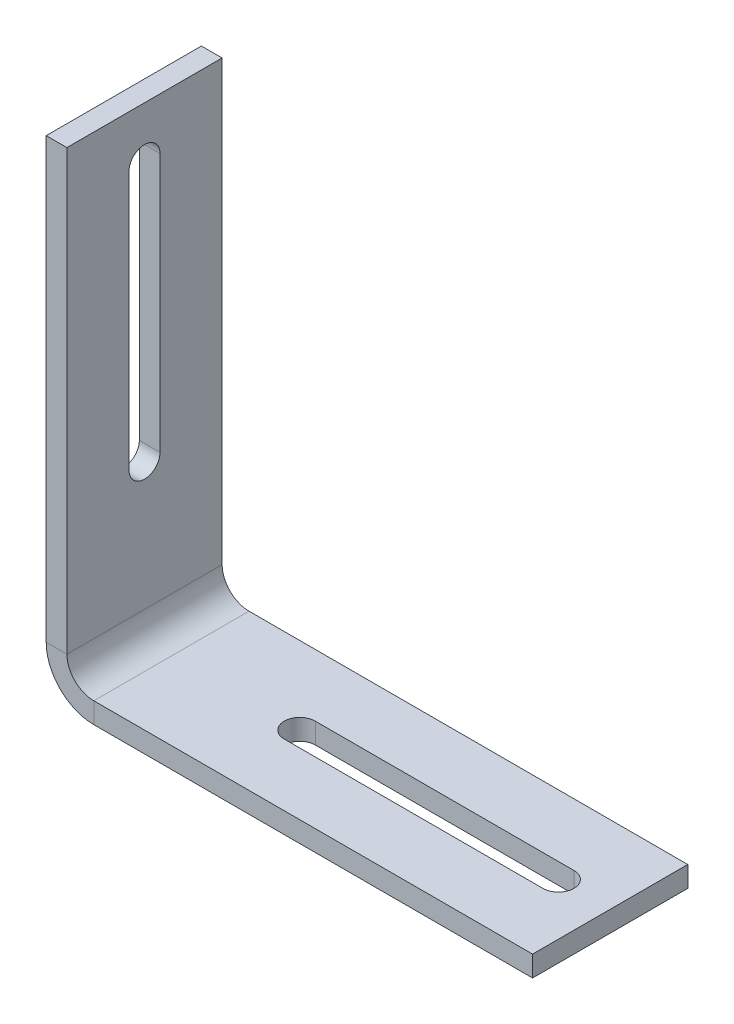
ISO-10303-21;
HEADER;
FILE_DESCRIPTION(('STEP AP214'),'2;1');
FILE_NAME('part.step','',(''),(''),'','','');
FILE_SCHEMA(('AUTOMOTIVE_DESIGN { 1 0 10303 214 1 1 1 1 }'));
ENDSEC;
DATA;
#1=APPLICATION_CONTEXT('core data for automotive mechanical design processes');
#2=APPLICATION_PROTOCOL_DEFINITION('international standard','automotive_design',2000,#1);
#3=PRODUCT_CONTEXT('',#1,'mechanical');
#4=PRODUCT('Part','Part','',(#3));
#5=PRODUCT_RELATED_PRODUCT_CATEGORY('part','',(#4));
#6=PRODUCT_DEFINITION_FORMATION('','',#4);
#7=PRODUCT_DEFINITION_CONTEXT('part definition',#1,'design');
#8=PRODUCT_DEFINITION('design','',#6,#7);
#9=PRODUCT_DEFINITION_SHAPE('','',#8);
#10=(LENGTH_UNIT() NAMED_UNIT(*) SI_UNIT(.MILLI.,.METRE.));
#11=(NAMED_UNIT(*) PLANE_ANGLE_UNIT() SI_UNIT($,.RADIAN.));
#12=(NAMED_UNIT(*) SI_UNIT($,.STERADIAN.) SOLID_ANGLE_UNIT());
#13=UNCERTAINTY_MEASURE_WITH_UNIT(LENGTH_MEASURE(1.E-05),#10,'distance_accuracy_value','');
#14=(GEOMETRIC_REPRESENTATION_CONTEXT(3) GLOBAL_UNCERTAINTY_ASSIGNED_CONTEXT((#13)) GLOBAL_UNIT_ASSIGNED_CONTEXT((#10,
#11,#12)) REPRESENTATION_CONTEXT('',''));
#15=CARTESIAN_POINT('',(0.,0.,0.));
#16=DIRECTION('',(0.,0.,1.));
#17=DIRECTION('',(1.,0.,0.));
#18=AXIS2_PLACEMENT_3D('',#15,#16,#17);
#19=CARTESIAN_POINT('',(2.6,-45.,10.));
#20=DIRECTION('',(0.,0.,1.));
#21=DIRECTION('',(1.,0.,0.));
#22=AXIS2_PLACEMENT_3D('',#19,#20,#21);
#23=PLANE('',#22);
#24=DIRECTION('',(0.,-1.,0.));
#25=VECTOR('',#24,1.);
#26=CARTESIAN_POINT('',(2.6,-45.,10.));
#27=LINE('',#26,#25);
#28=CARTESIAN_POINT('',(2.6,-45.,10.));
#29=VERTEX_POINT('',#28);
#30=CARTESIAN_POINT('',(2.6,-47.,10.));
#31=VERTEX_POINT('',#30);
#32=EDGE_CURVE('E285',#29,#31,#27,.T.);
#33=ORIENTED_EDGE('',*,*,#32,.F.);
#34=CARTESIAN_POINT('',(2.6,-42.4,10.));
#35=DIRECTION('',(0.,0.,-1.));
#36=DIRECTION('',(-1.,0.,0.));
#37=AXIS2_PLACEMENT_3D('',#34,#35,#36);
#38=CIRCLE('',#37,2.6);
#39=CARTESIAN_POINT('',(0.,-42.4,10.));
#40=VERTEX_POINT('',#39);
#41=EDGE_CURVE('E244',#40,#29,#38,.F.);
#42=ORIENTED_EDGE('',*,*,#41,.F.);
#43=DIRECTION('',(1.,0.,0.));
#44=VECTOR('',#43,1.);
#45=CARTESIAN_POINT('',(-1.99999999999999,-42.3999999999999,10.));
#46=LINE('',#45,#44);
#47=CARTESIAN_POINT('',(-1.99999999999999,-42.3999999999999,10.));
#48=VERTEX_POINT('',#47);
#49=EDGE_CURVE('E283',#48,#40,#46,.T.);
#50=ORIENTED_EDGE('',*,*,#49,.F.);
#51=CARTESIAN_POINT('',(2.6,-42.4,10.));
#52=DIRECTION('',(0.,0.,1.));
#53=DIRECTION('',(1.,0.,0.));
#54=AXIS2_PLACEMENT_3D('',#51,#52,#53);
#55=CIRCLE('',#54,4.6);
#56=EDGE_CURVE('E256',#48,#31,#55,.T.);
#57=ORIENTED_EDGE('',*,*,#56,.T.);
#58=EDGE_LOOP('',(#33,#42,#50,#57));
#59=FACE_BOUND('',#58,.T.);
#60=ADVANCED_FACE('F43',(#59),#23,.T.);
#61=CARTESIAN_POINT('',(-1.99999999999999,-42.3999999999999,10.));
#62=DIRECTION('',(0.,0.,1.));
#63=DIRECTION('',(1.,0.,0.));
#64=AXIS2_PLACEMENT_3D('',#61,#62,#63);
#65=PLANE('',#64);
#66=DIRECTION('',(1.,0.,0.));
#67=VECTOR('',#66,1.);
#68=CARTESIAN_POINT('',(0.,-45.,10.));
#69=LINE('',#68,#67);
#70=CARTESIAN_POINT('',(45.,-45.,10.));
#71=VERTEX_POINT('',#70);
#72=EDGE_CURVE('E241',#29,#71,#69,.T.);
#73=ORIENTED_EDGE('',*,*,#72,.F.);
#74=ORIENTED_EDGE('',*,*,#32,.T.);
#75=DIRECTION('',(1.,0.,0.));
#76=VECTOR('',#75,1.);
#77=CARTESIAN_POINT('',(0.,-47.,10.));
#78=LINE('',#77,#76);
#79=CARTESIAN_POINT('',(45.,-47.,10.));
#80=VERTEX_POINT('',#79);
#81=EDGE_CURVE('E236',#31,#80,#78,.T.);
#82=ORIENTED_EDGE('',*,*,#81,.T.);
#83=DIRECTION('',(0.,-1.,0.));
#84=VECTOR('',#83,1.);
#85=CARTESIAN_POINT('',(45.,-45.,10.));
#86=LINE('',#85,#84);
#87=EDGE_CURVE('E238',#71,#80,#86,.T.);
#88=ORIENTED_EDGE('',*,*,#87,.F.);
#89=EDGE_LOOP('',(#73,#74,#82,#88));
#90=FACE_BOUND('',#89,.T.);
#91=ADVANCED_FACE('F328',(#90),#65,.T.);
#92=CARTESIAN_POINT('',(0.,-42.4,-5.));
#93=DIRECTION('',(0.,0.,-1.));
#94=DIRECTION('',(-1.,0.,0.));
#95=AXIS2_PLACEMENT_3D('',#92,#93,#94);
#96=PLANE('',#95);
#97=DIRECTION('',(-1.,0.,0.));
#98=VECTOR('',#97,1.);
#99=CARTESIAN_POINT('',(0.,-42.4,-5.));
#100=LINE('',#99,#98);
#101=CARTESIAN_POINT('',(0.,-42.4,-5.));
#102=VERTEX_POINT('',#101);
#103=CARTESIAN_POINT('',(-1.99999999999999,-42.3999999999999,-5.));
#104=VERTEX_POINT('',#103);
#105=EDGE_CURVE('E281',#102,#104,#100,.T.);
#106=ORIENTED_EDGE('',*,*,#105,.F.);
#107=CARTESIAN_POINT('',(2.6,-42.4,-5.));
#108=DIRECTION('',(0.,0.,-1.));
#109=DIRECTION('',(-1.,0.,0.));
#110=AXIS2_PLACEMENT_3D('',#107,#108,#109);
#111=CIRCLE('',#110,2.6);
#112=CARTESIAN_POINT('',(2.6,-45.,-5.));
#113=VERTEX_POINT('',#112);
#114=EDGE_CURVE('E221',#102,#113,#111,.F.);
#115=ORIENTED_EDGE('',*,*,#114,.T.);
#116=DIRECTION('',(0.,1.,0.));
#117=VECTOR('',#116,1.);
#118=CARTESIAN_POINT('',(2.6,-47.,-5.));
#119=LINE('',#118,#117);
#120=CARTESIAN_POINT('',(2.6,-47.,-5.));
#121=VERTEX_POINT('',#120);
#122=EDGE_CURVE('E279',#121,#113,#119,.T.);
#123=ORIENTED_EDGE('',*,*,#122,.F.);
#124=CARTESIAN_POINT('',(2.6,-42.4,-5.));
#125=DIRECTION('',(0.,0.,1.));
#126=DIRECTION('',(1.,0.,0.));
#127=AXIS2_PLACEMENT_3D('',#124,#125,#126);
#128=CIRCLE('',#127,4.6);
#129=EDGE_CURVE('E233',#104,#121,#128,.T.);
#130=ORIENTED_EDGE('',*,*,#129,.F.);
#131=EDGE_LOOP('',(#106,#115,#123,#130));
#132=FACE_BOUND('',#131,.T.);
#133=ADVANCED_FACE('F333',(#132),#96,.T.);
#134=CARTESIAN_POINT('',(2.6,-47.,-5.));
#135=DIRECTION('',(0.,0.,-1.));
#136=DIRECTION('',(-1.,0.,0.));
#137=AXIS2_PLACEMENT_3D('',#134,#135,#136);
#138=PLANE('',#137);
#139=DIRECTION('',(0.,-1.,0.));
#140=VECTOR('',#139,1.);
#141=CARTESIAN_POINT('',(0.,0.,-5.));
#142=LINE('',#141,#140);
#143=CARTESIAN_POINT('',(0.,0.,-5.));
#144=VERTEX_POINT('',#143);
#145=EDGE_CURVE('E224',#144,#102,#142,.T.);
#146=ORIENTED_EDGE('',*,*,#145,.T.);
#147=ORIENTED_EDGE('',*,*,#105,.T.);
#148=DIRECTION('',(0.,-1.,0.));
#149=VECTOR('',#148,1.);
#150=CARTESIAN_POINT('',(-2.,0.,-5.));
#151=LINE('',#150,#149);
#152=CARTESIAN_POINT('',(-2.,0.,-5.));
#153=VERTEX_POINT('',#152);
#154=EDGE_CURVE('E230',#153,#104,#151,.T.);
#155=ORIENTED_EDGE('',*,*,#154,.F.);
#156=DIRECTION('',(1.,0.,0.));
#157=VECTOR('',#156,1.);
#158=CARTESIAN_POINT('',(-2.,0.,-5.));
#159=LINE('',#158,#157);
#160=EDGE_CURVE('E227',#153,#144,#159,.T.);
#161=ORIENTED_EDGE('',*,*,#160,.T.);
#162=EDGE_LOOP('',(#146,#147,#155,#161));
#163=FACE_BOUND('',#162,.T.);
#164=ADVANCED_FACE('F349',(#163),#138,.T.);
#165=CARTESIAN_POINT('',(0.,-47.,10.));
#166=DIRECTION('',(0.,1.,0.));
#167=DIRECTION('',(0.,0.,1.));
#168=AXIS2_PLACEMENT_3D('',#165,#166,#167);
#169=PLANE('',#168);
#170=DIRECTION('',(1.,0.,0.));
#171=VECTOR('',#170,1.);
#172=CARTESIAN_POINT('',(0.,-47.,4.));
#173=LINE('',#172,#171);
#174=CARTESIAN_POINT('',(15.,-47.,4.));
#175=VERTEX_POINT('',#174);
#176=CARTESIAN_POINT('',(40.,-47.,4.));
#177=VERTEX_POINT('',#176);
#178=EDGE_CURVE('E186',#175,#177,#173,.T.);
#179=ORIENTED_EDGE('',*,*,#178,.T.);
#180=CARTESIAN_POINT('',(40.,-47.,2.5));
#181=DIRECTION('',(0.,1.,0.));
#182=DIRECTION('',(0.,0.,1.));
#183=AXIS2_PLACEMENT_3D('',#180,#181,#182);
#184=CIRCLE('',#183,1.5);
#185=CARTESIAN_POINT('',(40.,-47.,0.999999999999995));
#186=VERTEX_POINT('',#185);
#187=EDGE_CURVE('E189',#177,#186,#184,.T.);
#188=ORIENTED_EDGE('',*,*,#187,.T.);
#189=DIRECTION('',(-1.,0.,0.));
#190=VECTOR('',#189,1.);
#191=CARTESIAN_POINT('',(0.,-47.,1.));
#192=LINE('',#191,#190);
#193=CARTESIAN_POINT('',(15.,-47.,0.999999999999999));
#194=VERTEX_POINT('',#193);
#195=EDGE_CURVE('E181',#186,#194,#192,.T.);
#196=ORIENTED_EDGE('',*,*,#195,.T.);
#197=CARTESIAN_POINT('',(15.,-47.,2.5));
#198=DIRECTION('',(0.,1.,0.));
#199=DIRECTION('',(0.,0.,1.));
#200=AXIS2_PLACEMENT_3D('',#197,#198,#199);
#201=CIRCLE('',#200,1.5);
#202=EDGE_CURVE('E161',#194,#175,#201,.T.);
#203=ORIENTED_EDGE('',*,*,#202,.T.);
#204=EDGE_LOOP('',(#179,#188,#196,#203));
#205=FACE_BOUND('',#204,.T.);
#206=DIRECTION('',(0.,0.,-1.));
#207=VECTOR('',#206,1.);
#208=CARTESIAN_POINT('',(2.6,-47.,10.));
#209=LINE('',#208,#207);
#210=EDGE_CURVE('E259',#31,#121,#209,.T.);
#211=ORIENTED_EDGE('',*,*,#210,.T.);
#212=DIRECTION('',(1.,0.,0.));
#213=VECTOR('',#212,1.);
#214=CARTESIAN_POINT('',(0.,-47.,-5.));
#215=LINE('',#214,#213);
#216=CARTESIAN_POINT('',(45.,-47.,-5.));
#217=VERTEX_POINT('',#216);
#218=EDGE_CURVE('E206',#121,#217,#215,.T.);
#219=ORIENTED_EDGE('',*,*,#218,.T.);
#220=DIRECTION('',(0.,0.,-1.));
#221=VECTOR('',#220,1.);
#222=CARTESIAN_POINT('',(45.,-47.,10.));
#223=LINE('',#222,#221);
#224=EDGE_CURVE('E277',#80,#217,#223,.T.);
#225=ORIENTED_EDGE('',*,*,#224,.F.);
#226=ORIENTED_EDGE('',*,*,#81,.F.);
#227=EDGE_LOOP('',(#211,#219,#225,#226));
#228=FACE_BOUND('',#227,.T.);
#229=ADVANCED_FACE('F366',(#205,#228),#169,.F.);
#230=CARTESIAN_POINT('',(45.,-45.,10.));
#231=DIRECTION('',(1.,0.,0.));
#232=DIRECTION('',(0.,0.,-1.));
#233=AXIS2_PLACEMENT_3D('',#230,#231,#232);
#234=PLANE('',#233);
#235=ORIENTED_EDGE('',*,*,#224,.T.);
#236=DIRECTION('',(0.,-1.,0.));
#237=VECTOR('',#236,1.);
#238=CARTESIAN_POINT('',(45.,-45.,-5.));
#239=LINE('',#238,#237);
#240=CARTESIAN_POINT('',(45.,-45.,-5.));
#241=VERTEX_POINT('',#240);
#242=EDGE_CURVE('E215',#241,#217,#239,.T.);
#243=ORIENTED_EDGE('',*,*,#242,.F.);
#244=DIRECTION('',(0.,0.,-1.));
#245=VECTOR('',#244,1.);
#246=CARTESIAN_POINT('',(45.,-45.,10.));
#247=LINE('',#246,#245);
#248=EDGE_CURVE('E275',#71,#241,#247,.T.);
#249=ORIENTED_EDGE('',*,*,#248,.F.);
#250=ORIENTED_EDGE('',*,*,#87,.T.);
#251=EDGE_LOOP('',(#235,#243,#249,#250));
#252=FACE_BOUND('',#251,.T.);
#253=ADVANCED_FACE('F369',(#252),#234,.T.);
#254=CARTESIAN_POINT('',(0.,-45.,10.));
#255=DIRECTION('',(0.,1.,0.));
#256=DIRECTION('',(0.,0.,1.));
#257=AXIS2_PLACEMENT_3D('',#254,#255,#256);
#258=PLANE('',#257);
#259=CARTESIAN_POINT('',(40.,-45.,2.5));
#260=DIRECTION('',(0.,1.,0.));
#261=DIRECTION('',(0.,0.,1.));
#262=AXIS2_PLACEMENT_3D('',#259,#260,#261);
#263=CIRCLE('',#262,1.5);
#264=CARTESIAN_POINT('',(40.,-45.,4.));
#265=VERTEX_POINT('',#264);
#266=CARTESIAN_POINT('',(40.,-45.,0.999999999999996));
#267=VERTEX_POINT('',#266);
#268=EDGE_CURVE('E65',#265,#267,#263,.T.);
#269=ORIENTED_EDGE('',*,*,#268,.F.);
#270=DIRECTION('',(1.,0.,0.));
#271=VECTOR('',#270,1.);
#272=CARTESIAN_POINT('',(40.,-45.,4.));
#273=LINE('',#272,#271);
#274=CARTESIAN_POINT('',(15.,-45.,4.));
#275=VERTEX_POINT('',#274);
#276=EDGE_CURVE('E174',#275,#265,#273,.T.);
#277=ORIENTED_EDGE('',*,*,#276,.F.);
#278=CARTESIAN_POINT('',(15.,-45.,2.5));
#279=DIRECTION('',(0.,1.,0.));
#280=DIRECTION('',(0.,0.,1.));
#281=AXIS2_PLACEMENT_3D('',#278,#279,#280);
#282=CIRCLE('',#281,1.5);
#283=CARTESIAN_POINT('',(15.,-45.,0.999999999999997));
#284=VERTEX_POINT('',#283);
#285=EDGE_CURVE('E158',#284,#275,#282,.T.);
#286=ORIENTED_EDGE('',*,*,#285,.F.);
#287=DIRECTION('',(-1.,0.,0.));
#288=VECTOR('',#287,1.);
#289=CARTESIAN_POINT('',(40.,-45.,0.999999999999995));
#290=LINE('',#289,#288);
#291=EDGE_CURVE('E167',#267,#284,#290,.T.);
#292=ORIENTED_EDGE('',*,*,#291,.F.);
#293=EDGE_LOOP('',(#269,#277,#286,#292));
#294=FACE_BOUND('',#293,.T.);
#295=ORIENTED_EDGE('',*,*,#248,.T.);
#296=DIRECTION('',(1.,0.,0.));
#297=VECTOR('',#296,1.);
#298=CARTESIAN_POINT('',(0.,-45.,-5.));
#299=LINE('',#298,#297);
#300=EDGE_CURVE('E218',#113,#241,#299,.T.);
#301=ORIENTED_EDGE('',*,*,#300,.F.);
#302=DIRECTION('',(0.,0.,-1.));
#303=VECTOR('',#302,1.);
#304=CARTESIAN_POINT('',(2.6,-45.,10.));
#305=LINE('',#304,#303);
#306=EDGE_CURVE('E272',#29,#113,#305,.T.);
#307=ORIENTED_EDGE('',*,*,#306,.F.);
#308=ORIENTED_EDGE('',*,*,#72,.T.);
#309=EDGE_LOOP('',(#295,#301,#307,#308));
#310=FACE_BOUND('',#309,.T.);
#311=ADVANCED_FACE('F171',(#294,#310),#258,.T.);
#312=CARTESIAN_POINT('',(2.6,-42.4,10.));
#313=DIRECTION('',(0.,0.,-1.));
#314=DIRECTION('',(-1.,0.,0.));
#315=AXIS2_PLACEMENT_3D('',#312,#313,#314);
#316=CYLINDRICAL_SURFACE('',#315,2.6);
#317=ORIENTED_EDGE('',*,*,#306,.T.);
#318=ORIENTED_EDGE('',*,*,#114,.F.);
#319=DIRECTION('',(0.,0.,-1.));
#320=VECTOR('',#319,1.);
#321=CARTESIAN_POINT('',(0.,-42.4,10.));
#322=LINE('',#321,#320);
#323=EDGE_CURVE('E269',#40,#102,#322,.T.);
#324=ORIENTED_EDGE('',*,*,#323,.F.);
#325=ORIENTED_EDGE('',*,*,#41,.T.);
#326=EDGE_LOOP('',(#317,#318,#324,#325));
#327=FACE_BOUND('',#326,.T.);
#328=ADVANCED_FACE('F345',(#327),#316,.F.);
#329=CARTESIAN_POINT('',(0.,0.,10.));
#330=DIRECTION('',(1.,0.,0.));
#331=DIRECTION('',(0.,1.,0.));
#332=AXIS2_PLACEMENT_3D('',#329,#330,#331);
#333=PLANE('',#332);
#334=CARTESIAN_POINT('',(0.,-5.,2.5));
#335=DIRECTION('',(1.,0.,0.));
#336=DIRECTION('',(0.,1.,0.));
#337=AXIS2_PLACEMENT_3D('',#334,#335,#336);
#338=CIRCLE('',#337,1.5);
#339=CARTESIAN_POINT('',(0.,-5.,0.999999999999999));
#340=VERTEX_POINT('',#339);
#341=CARTESIAN_POINT('',(0.,-5.,4.));
#342=VERTEX_POINT('',#341);
#343=EDGE_CURVE('E192',#340,#342,#338,.T.);
#344=ORIENTED_EDGE('',*,*,#343,.F.);
#345=DIRECTION('',(0.,1.,0.));
#346=VECTOR('',#345,1.);
#347=CARTESIAN_POINT('',(0.,-5.,0.999999999999999));
#348=LINE('',#347,#346);
#349=CARTESIAN_POINT('',(0.,-30.,0.999999999999996));
#350=VERTEX_POINT('',#349);
#351=EDGE_CURVE('E200',#350,#340,#348,.T.);
#352=ORIENTED_EDGE('',*,*,#351,.F.);
#353=CARTESIAN_POINT('',(0.,-30.,2.5));
#354=DIRECTION('',(1.,0.,0.));
#355=DIRECTION('',(0.,1.,0.));
#356=AXIS2_PLACEMENT_3D('',#353,#354,#355);
#357=CIRCLE('',#356,1.5);
#358=CARTESIAN_POINT('',(0.,-30.,4.));
#359=VERTEX_POINT('',#358);
#360=EDGE_CURVE('E197',#359,#350,#357,.T.);
#361=ORIENTED_EDGE('',*,*,#360,.F.);
#362=DIRECTION('',(0.,-1.,0.));
#363=VECTOR('',#362,1.);
#364=CARTESIAN_POINT('',(0.,-5.,4.));
#365=LINE('',#364,#363);
#366=EDGE_CURVE('E194',#342,#359,#365,.T.);
#367=ORIENTED_EDGE('',*,*,#366,.F.);
#368=EDGE_LOOP('',(#344,#352,#361,#367));
#369=FACE_BOUND('',#368,.T.);
#370=ORIENTED_EDGE('',*,*,#323,.T.);
#371=ORIENTED_EDGE('',*,*,#145,.F.);
#372=DIRECTION('',(0.,0.,-1.));
#373=VECTOR('',#372,1.);
#374=CARTESIAN_POINT('',(0.,0.,10.));
#375=LINE('',#374,#373);
#376=CARTESIAN_POINT('',(0.,0.,10.));
#377=VERTEX_POINT('',#376);
#378=EDGE_CURVE('E267',#377,#144,#375,.T.);
#379=ORIENTED_EDGE('',*,*,#378,.F.);
#380=DIRECTION('',(0.,-1.,0.));
#381=VECTOR('',#380,1.);
#382=CARTESIAN_POINT('',(0.,0.,10.));
#383=LINE('',#382,#381);
#384=EDGE_CURVE('E247',#377,#40,#383,.T.);
#385=ORIENTED_EDGE('',*,*,#384,.T.);
#386=EDGE_LOOP('',(#370,#371,#379,#385));
#387=FACE_BOUND('',#386,.T.);
#388=ADVANCED_FACE('F308',(#369,#387),#333,.T.);
#389=CARTESIAN_POINT('',(-2.,0.,10.));
#390=DIRECTION('',(0.,1.,0.));
#391=DIRECTION('',(-1.,0.,0.));
#392=AXIS2_PLACEMENT_3D('',#389,#390,#391);
#393=PLANE('',#392);
#394=ORIENTED_EDGE('',*,*,#378,.T.);
#395=ORIENTED_EDGE('',*,*,#160,.F.);
#396=DIRECTION('',(0.,0.,-1.));
#397=VECTOR('',#396,1.);
#398=CARTESIAN_POINT('',(-2.,0.,10.));
#399=LINE('',#398,#397);
#400=CARTESIAN_POINT('',(-2.,0.,10.));
#401=VERTEX_POINT('',#400);
#402=EDGE_CURVE('E265',#401,#153,#399,.T.);
#403=ORIENTED_EDGE('',*,*,#402,.F.);
#404=DIRECTION('',(1.,0.,0.));
#405=VECTOR('',#404,1.);
#406=CARTESIAN_POINT('',(-2.,0.,10.));
#407=LINE('',#406,#405);
#408=EDGE_CURVE('E250',#401,#377,#407,.T.);
#409=ORIENTED_EDGE('',*,*,#408,.T.);
#410=EDGE_LOOP('',(#394,#395,#403,#409));
#411=FACE_BOUND('',#410,.T.);
#412=ADVANCED_FACE('F353',(#411),#393,.T.);
#413=CARTESIAN_POINT('',(-2.,0.,10.));
#414=DIRECTION('',(1.,0.,0.));
#415=DIRECTION('',(0.,1.,0.));
#416=AXIS2_PLACEMENT_3D('',#413,#414,#415);
#417=PLANE('',#416);
#418=DIRECTION('',(0.,1.,0.));
#419=VECTOR('',#418,1.);
#420=CARTESIAN_POINT('',(-2.,0.,0.999999999999999));
#421=LINE('',#420,#419);
#422=CARTESIAN_POINT('',(-2.,-30.,0.999999999999996));
#423=VERTEX_POINT('',#422);
#424=CARTESIAN_POINT('',(-2.,-5.,0.999999999999999));
#425=VERTEX_POINT('',#424);
#426=EDGE_CURVE('E50',#423,#425,#421,.T.);
#427=ORIENTED_EDGE('',*,*,#426,.T.);
#428=CARTESIAN_POINT('',(-2.,-5.,2.5));
#429=DIRECTION('',(1.,0.,0.));
#430=DIRECTION('',(0.,1.,0.));
#431=AXIS2_PLACEMENT_3D('',#428,#429,#430);
#432=CIRCLE('',#431,1.5);
#433=CARTESIAN_POINT('',(-2.,-5.,4.));
#434=VERTEX_POINT('',#433);
#435=EDGE_CURVE('E11',#425,#434,#432,.T.);
#436=ORIENTED_EDGE('',*,*,#435,.T.);
#437=DIRECTION('',(0.,-1.,0.));
#438=VECTOR('',#437,1.);
#439=CARTESIAN_POINT('',(-2.,0.,4.));
#440=LINE('',#439,#438);
#441=CARTESIAN_POINT('',(-2.,-30.,4.));
#442=VERTEX_POINT('',#441);
#443=EDGE_CURVE('E287',#434,#442,#440,.T.);
#444=ORIENTED_EDGE('',*,*,#443,.T.);
#445=CARTESIAN_POINT('',(-2.,-30.,2.5));
#446=DIRECTION('',(1.,0.,0.));
#447=DIRECTION('',(0.,1.,0.));
#448=AXIS2_PLACEMENT_3D('',#445,#446,#447);
#449=CIRCLE('',#448,1.5);
#450=EDGE_CURVE('E290',#442,#423,#449,.T.);
#451=ORIENTED_EDGE('',*,*,#450,.T.);
#452=EDGE_LOOP('',(#427,#436,#444,#451));
#453=FACE_BOUND('',#452,.T.);
#454=ORIENTED_EDGE('',*,*,#402,.T.);
#455=ORIENTED_EDGE('',*,*,#154,.T.);
#456=DIRECTION('',(0.,0.,-1.));
#457=VECTOR('',#456,1.);
#458=CARTESIAN_POINT('',(-1.99999999999999,-42.3999999999999,10.));
#459=LINE('',#458,#457);
#460=EDGE_CURVE('E262',#48,#104,#459,.T.);
#461=ORIENTED_EDGE('',*,*,#460,.F.);
#462=DIRECTION('',(0.,-1.,0.));
#463=VECTOR('',#462,1.);
#464=CARTESIAN_POINT('',(-2.,0.,10.));
#465=LINE('',#464,#463);
#466=EDGE_CURVE('E253',#401,#48,#465,.T.);
#467=ORIENTED_EDGE('',*,*,#466,.F.);
#468=EDGE_LOOP('',(#454,#455,#461,#467));
#469=FACE_BOUND('',#468,.T.);
#470=ADVANCED_FACE('F294',(#453,#469),#417,.F.);
#471=CARTESIAN_POINT('',(2.6,-42.4,10.));
#472=DIRECTION('',(0.,0.,-1.));
#473=DIRECTION('',(-1.,0.,0.));
#474=AXIS2_PLACEMENT_3D('',#471,#472,#473);
#475=CYLINDRICAL_SURFACE('',#474,4.6);
#476=ORIENTED_EDGE('',*,*,#460,.T.);
#477=ORIENTED_EDGE('',*,*,#129,.T.);
#478=ORIENTED_EDGE('',*,*,#210,.F.);
#479=ORIENTED_EDGE('',*,*,#56,.F.);
#480=EDGE_LOOP('',(#476,#477,#478,#479));
#481=FACE_BOUND('',#480,.T.);
#482=ADVANCED_FACE('F361',(#481),#475,.T.);
#483=CARTESIAN_POINT('',(2.6,-42.4,10.));
#484=DIRECTION('',(0.,0.,-1.));
#485=DIRECTION('',(-1.,0.,0.));
#486=AXIS2_PLACEMENT_3D('',#483,#484,#485);
#487=PLANE('',#486);
#488=ORIENTED_EDGE('',*,*,#466,.T.);
#489=ORIENTED_EDGE('',*,*,#49,.T.);
#490=ORIENTED_EDGE('',*,*,#384,.F.);
#491=ORIENTED_EDGE('',*,*,#408,.F.);
#492=EDGE_LOOP('',(#488,#489,#490,#491));
#493=FACE_BOUND('',#492,.T.);
#494=ADVANCED_FACE('F357',(#493),#487,.F.);
#495=CARTESIAN_POINT('',(2.6,-42.4,-5.));
#496=DIRECTION('',(0.,0.,-1.));
#497=DIRECTION('',(-1.,0.,0.));
#498=AXIS2_PLACEMENT_3D('',#495,#496,#497);
#499=PLANE('',#498);
#500=ORIENTED_EDGE('',*,*,#218,.F.);
#501=ORIENTED_EDGE('',*,*,#122,.T.);
#502=ORIENTED_EDGE('',*,*,#300,.T.);
#503=ORIENTED_EDGE('',*,*,#242,.T.);
#504=EDGE_LOOP('',(#500,#501,#502,#503));
#505=FACE_BOUND('',#504,.T.);
#506=ADVANCED_FACE('F371',(#505),#499,.T.);
#507=CARTESIAN_POINT('',(-10.,-5.,2.5));
#508=DIRECTION('',(1.,0.,0.));
#509=DIRECTION('',(0.,1.,0.));
#510=AXIS2_PLACEMENT_3D('',#507,#508,#509);
#511=CYLINDRICAL_SURFACE('',#510,1.5);
#512=DIRECTION('',(1.,0.,0.));
#513=VECTOR('',#512,1.);
#514=CARTESIAN_POINT('',(-10.,-5.,0.999999999999999));
#515=LINE('',#514,#513);
#516=EDGE_CURVE('E204',#425,#340,#515,.T.);
#517=ORIENTED_EDGE('',*,*,#516,.T.);
#518=ORIENTED_EDGE('',*,*,#343,.T.);
#519=DIRECTION('',(1.,0.,0.));
#520=VECTOR('',#519,1.);
#521=CARTESIAN_POINT('',(-10.,-5.,4.));
#522=LINE('',#521,#520);
#523=EDGE_CURVE('E203',#434,#342,#522,.T.);
#524=ORIENTED_EDGE('',*,*,#523,.F.);
#525=ORIENTED_EDGE('',*,*,#435,.F.);
#526=EDGE_LOOP('',(#517,#518,#524,#525));
#527=FACE_BOUND('',#526,.T.);
#528=ADVANCED_FACE('F312',(#527),#511,.F.);
#529=CARTESIAN_POINT('',(-10.,-5.,0.999999999999999));
#530=DIRECTION('',(0.,0.,-1.));
#531=DIRECTION('',(0.,1.,0.));
#532=AXIS2_PLACEMENT_3D('',#529,#530,#531);
#533=PLANE('',#532);
#534=DIRECTION('',(1.,0.,0.));
#535=VECTOR('',#534,1.);
#536=CARTESIAN_POINT('',(-10.,-30.,0.999999999999996));
#537=LINE('',#536,#535);
#538=EDGE_CURVE('E207',#423,#350,#537,.T.);
#539=ORIENTED_EDGE('',*,*,#538,.T.);
#540=ORIENTED_EDGE('',*,*,#351,.T.);
#541=ORIENTED_EDGE('',*,*,#516,.F.);
#542=ORIENTED_EDGE('',*,*,#426,.F.);
#543=EDGE_LOOP('',(#539,#540,#541,#542));
#544=FACE_BOUND('',#543,.T.);
#545=ADVANCED_FACE('F300',(#544),#533,.F.);
#546=CARTESIAN_POINT('',(-10.,-30.,2.5));
#547=DIRECTION('',(1.,0.,0.));
#548=DIRECTION('',(0.,1.,0.));
#549=AXIS2_PLACEMENT_3D('',#546,#547,#548);
#550=CYLINDRICAL_SURFACE('',#549,1.5);
#551=DIRECTION('',(1.,0.,0.));
#552=VECTOR('',#551,1.);
#553=CARTESIAN_POINT('',(-10.,-30.,4.));
#554=LINE('',#553,#552);
#555=EDGE_CURVE('E209',#442,#359,#554,.T.);
#556=ORIENTED_EDGE('',*,*,#555,.T.);
#557=ORIENTED_EDGE('',*,*,#360,.T.);
#558=ORIENTED_EDGE('',*,*,#538,.F.);
#559=ORIENTED_EDGE('',*,*,#450,.F.);
#560=EDGE_LOOP('',(#556,#557,#558,#559));
#561=FACE_BOUND('',#560,.T.);
#562=ADVANCED_FACE('F302',(#561),#550,.F.);
#563=CARTESIAN_POINT('',(-10.,-5.,4.));
#564=DIRECTION('',(0.,0.,1.));
#565=DIRECTION('',(0.,-1.,0.));
#566=AXIS2_PLACEMENT_3D('',#563,#564,#565);
#567=PLANE('',#566);
#568=ORIENTED_EDGE('',*,*,#523,.T.);
#569=ORIENTED_EDGE('',*,*,#366,.T.);
#570=ORIENTED_EDGE('',*,*,#555,.F.);
#571=ORIENTED_EDGE('',*,*,#443,.F.);
#572=EDGE_LOOP('',(#568,#569,#570,#571));
#573=FACE_BOUND('',#572,.T.);
#574=ADVANCED_FACE('F314',(#573),#567,.F.);
#575=CARTESIAN_POINT('',(40.,-55.,2.5));
#576=DIRECTION('',(0.,1.,0.));
#577=DIRECTION('',(0.,0.,1.));
#578=AXIS2_PLACEMENT_3D('',#575,#576,#577);
#579=CYLINDRICAL_SURFACE('',#578,1.5);
#580=DIRECTION('',(0.,1.,0.));
#581=VECTOR('',#580,1.);
#582=CARTESIAN_POINT('',(40.,-55.,4.));
#583=LINE('',#582,#581);
#584=EDGE_CURVE('E179',#177,#265,#583,.T.);
#585=ORIENTED_EDGE('',*,*,#584,.T.);
#586=ORIENTED_EDGE('',*,*,#268,.T.);
#587=DIRECTION('',(0.,1.,0.));
#588=VECTOR('',#587,1.);
#589=CARTESIAN_POINT('',(40.,-55.,0.999999999999995));
#590=LINE('',#589,#588);
#591=EDGE_CURVE('E164',#186,#267,#590,.T.);
#592=ORIENTED_EDGE('',*,*,#591,.F.);
#593=ORIENTED_EDGE('',*,*,#187,.F.);
#594=EDGE_LOOP('',(#585,#586,#592,#593));
#595=FACE_BOUND('',#594,.T.);
#596=ADVANCED_FACE('F316',(#595),#579,.F.);
#597=CARTESIAN_POINT('',(40.,-55.,4.));
#598=DIRECTION('',(0.,0.,1.));
#599=DIRECTION('',(1.,0.,0.));
#600=AXIS2_PLACEMENT_3D('',#597,#598,#599);
#601=PLANE('',#600);
#602=DIRECTION('',(0.,1.,0.));
#603=VECTOR('',#602,1.);
#604=CARTESIAN_POINT('',(15.,-55.,4.));
#605=LINE('',#604,#603);
#606=EDGE_CURVE('E163',#175,#275,#605,.T.);
#607=ORIENTED_EDGE('',*,*,#606,.T.);
#608=ORIENTED_EDGE('',*,*,#276,.T.);
#609=ORIENTED_EDGE('',*,*,#584,.F.);
#610=ORIENTED_EDGE('',*,*,#178,.F.);
#611=EDGE_LOOP('',(#607,#608,#609,#610));
#612=FACE_BOUND('',#611,.T.);
#613=ADVANCED_FACE('F323',(#612),#601,.F.);
#614=CARTESIAN_POINT('',(15.,-55.,2.5));
#615=DIRECTION('',(0.,1.,0.));
#616=DIRECTION('',(0.,0.,1.));
#617=AXIS2_PLACEMENT_3D('',#614,#615,#616);
#618=CYLINDRICAL_SURFACE('',#617,1.5);
#619=DIRECTION('',(0.,1.,0.));
#620=VECTOR('',#619,1.);
#621=CARTESIAN_POINT('',(15.,-55.,0.999999999999997));
#622=LINE('',#621,#620);
#623=EDGE_CURVE('E57',#194,#284,#622,.T.);
#624=ORIENTED_EDGE('',*,*,#623,.T.);
#625=ORIENTED_EDGE('',*,*,#285,.T.);
#626=ORIENTED_EDGE('',*,*,#606,.F.);
#627=ORIENTED_EDGE('',*,*,#202,.F.);
#628=EDGE_LOOP('',(#624,#625,#626,#627));
#629=FACE_BOUND('',#628,.T.);
#630=ADVANCED_FACE('F155',(#629),#618,.F.);
#631=CARTESIAN_POINT('',(40.,-55.,0.999999999999995));
#632=DIRECTION('',(0.,0.,-1.));
#633=DIRECTION('',(-1.,0.,0.));
#634=AXIS2_PLACEMENT_3D('',#631,#632,#633);
#635=PLANE('',#634);
#636=ORIENTED_EDGE('',*,*,#591,.T.);
#637=ORIENTED_EDGE('',*,*,#291,.T.);
#638=ORIENTED_EDGE('',*,*,#623,.F.);
#639=ORIENTED_EDGE('',*,*,#195,.F.);
#640=EDGE_LOOP('',(#636,#637,#638,#639));
#641=FACE_BOUND('',#640,.T.);
#642=ADVANCED_FACE('F168',(#641),#635,.F.);
#643=CLOSED_SHELL('',(#60,#91,#133,#164,#229,#253,#311,#328,#388,#412,#470,#482,#494,#506,#528,
#545,#562,#574,#596,#613,#630,#642));
#644=MANIFOLD_SOLID_BREP('B2',#643);
#645=ADVANCED_BREP_SHAPE_REPRESENTATION('',(#18,#644),#14);
#646=SHAPE_DEFINITION_REPRESENTATION(#9,#645);
ENDSEC;
END-ISO-10303-21;
